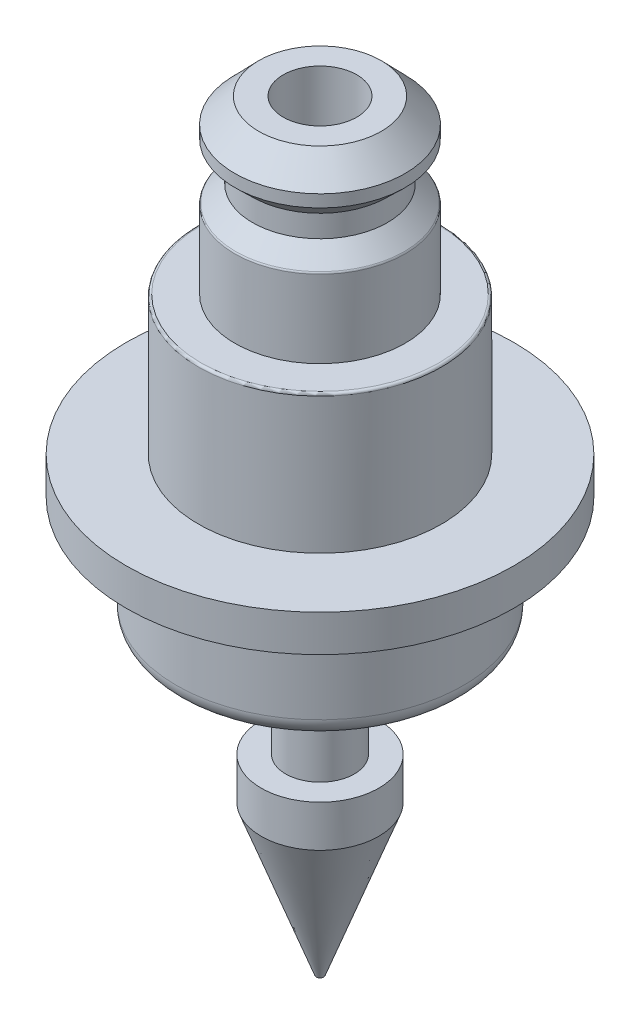
ISO-10303-21;
HEADER;
FILE_DESCRIPTION(('STEP AP214'),'2;1');
FILE_NAME('part.step','',(''),(''),'','','');
FILE_SCHEMA(('AUTOMOTIVE_DESIGN { 1 0 10303 214 1 1 1 1 }'));
ENDSEC;
DATA;
#1=APPLICATION_CONTEXT('core data for automotive mechanical design processes');
#2=APPLICATION_PROTOCOL_DEFINITION('international standard','automotive_design',2000,#1);
#3=PRODUCT_CONTEXT('',#1,'mechanical');
#4=PRODUCT('Part','Part','',(#3));
#5=PRODUCT_RELATED_PRODUCT_CATEGORY('part','',(#4));
#6=PRODUCT_DEFINITION_FORMATION('','',#4);
#7=PRODUCT_DEFINITION_CONTEXT('part definition',#1,'design');
#8=PRODUCT_DEFINITION('design','',#6,#7);
#9=PRODUCT_DEFINITION_SHAPE('','',#8);
#10=(LENGTH_UNIT() NAMED_UNIT(*) SI_UNIT(.MILLI.,.METRE.));
#11=(NAMED_UNIT(*) PLANE_ANGLE_UNIT() SI_UNIT($,.RADIAN.));
#12=(NAMED_UNIT(*) SI_UNIT($,.STERADIAN.) SOLID_ANGLE_UNIT());
#13=UNCERTAINTY_MEASURE_WITH_UNIT(LENGTH_MEASURE(1.E-05),#10,'distance_accuracy_value','');
#14=(GEOMETRIC_REPRESENTATION_CONTEXT(3) GLOBAL_UNCERTAINTY_ASSIGNED_CONTEXT((#13)) GLOBAL_UNIT_ASSIGNED_CONTEXT((#10,
#11,#12)) REPRESENTATION_CONTEXT('',''));
#15=CARTESIAN_POINT('',(0.,0.,0.));
#16=DIRECTION('',(0.,0.,1.));
#17=DIRECTION('',(1.,0.,0.));
#18=AXIS2_PLACEMENT_3D('',#15,#16,#17);
#19=CARTESIAN_POINT('',(0.,0.,0.));
#20=DIRECTION('',(0.,-1.,0.));
#21=DIRECTION('',(0.,0.,-1.));
#22=AXIS2_PLACEMENT_3D('',#19,#20,#21);
#23=CYLINDRICAL_SURFACE('',#22,1.5);
#24=CARTESIAN_POINT('',(0.,0.,0.));
#25=DIRECTION('',(0.,-1.,0.));
#26=DIRECTION('',(0.,0.,-1.));
#27=AXIS2_PLACEMENT_3D('',#24,#25,#26);
#28=CIRCLE('',#27,1.5);
#29=CARTESIAN_POINT('',(0.,0.,-1.5));
#30=VERTEX_POINT('',#29);
#31=EDGE_CURVE('E117',#30,#30,#28,.T.);
#32=ORIENTED_EDGE('',*,*,#31,.T.);
#33=EDGE_LOOP('',(#32));
#34=FACE_BOUND('',#33,.T.);
#35=CARTESIAN_POINT('',(0.,14.15,0.));
#36=DIRECTION('',(0.,-1.,0.));
#37=DIRECTION('',(0.,0.,-1.));
#38=AXIS2_PLACEMENT_3D('',#35,#36,#37);
#39=CIRCLE('',#38,1.5);
#40=CARTESIAN_POINT('',(0.,14.15,-1.5));
#41=VERTEX_POINT('',#40);
#42=EDGE_CURVE('E64',#41,#41,#39,.T.);
#43=ORIENTED_EDGE('',*,*,#42,.F.);
#44=EDGE_LOOP('',(#43));
#45=FACE_BOUND('',#44,.T.);
#46=ADVANCED_FACE('F38',(#34,#45),#23,.F.);
#47=CARTESIAN_POINT('',(1.5,14.15,0.));
#48=DIRECTION('',(0.,1.,0.));
#49=DIRECTION('',(0.,0.,1.));
#50=AXIS2_PLACEMENT_3D('',#47,#48,#49);
#51=PLANE('',#50);
#52=ORIENTED_EDGE('',*,*,#42,.T.);
#53=EDGE_LOOP('',(#52));
#54=FACE_BOUND('',#53,.T.);
#55=CARTESIAN_POINT('',(0.,14.15,0.));
#56=DIRECTION('',(0.,-1.,0.));
#57=DIRECTION('',(0.,0.,-1.));
#58=AXIS2_PLACEMENT_3D('',#55,#56,#57);
#59=CIRCLE('',#58,2.5);
#60=CARTESIAN_POINT('',(0.,14.15,-2.5));
#61=VERTEX_POINT('',#60);
#62=EDGE_CURVE('E67',#61,#61,#59,.T.);
#63=ORIENTED_EDGE('',*,*,#62,.F.);
#64=EDGE_LOOP('',(#63));
#65=FACE_BOUND('',#64,.T.);
#66=ADVANCED_FACE('F140',(#54,#65),#51,.T.);
#67=CARTESIAN_POINT('',(0.,13.15,0.));
#68=DIRECTION('',(0.,-1.,0.));
#69=DIRECTION('',(0.,0.,-1.));
#70=AXIS2_PLACEMENT_3D('',#67,#68,#69);
#71=CONICAL_SURFACE('',#70,3.475,0.772740611563396);
#72=ORIENTED_EDGE('',*,*,#62,.T.);
#73=EDGE_LOOP('',(#72));
#74=FACE_BOUND('',#73,.T.);
#75=CARTESIAN_POINT('',(0.,13.15,0.));
#76=DIRECTION('',(0.,-1.,0.));
#77=DIRECTION('',(0.,0.,-1.));
#78=AXIS2_PLACEMENT_3D('',#75,#76,#77);
#79=CIRCLE('',#78,3.475);
#80=CARTESIAN_POINT('',(0.,13.15,-3.475));
#81=VERTEX_POINT('',#80);
#82=EDGE_CURVE('E70',#81,#81,#79,.T.);
#83=ORIENTED_EDGE('',*,*,#82,.F.);
#84=EDGE_LOOP('',(#83));
#85=FACE_BOUND('',#84,.T.);
#86=ADVANCED_FACE('F145',(#74,#85),#71,.T.);
#87=CARTESIAN_POINT('',(0.,0.,0.));
#88=DIRECTION('',(0.,-1.,0.));
#89=DIRECTION('',(0.,0.,-1.));
#90=AXIS2_PLACEMENT_3D('',#87,#88,#89);
#91=CYLINDRICAL_SURFACE('',#90,3.475);
#92=ORIENTED_EDGE('',*,*,#82,.T.);
#93=EDGE_LOOP('',(#92));
#94=FACE_BOUND('',#93,.T.);
#95=CARTESIAN_POINT('',(0.,12.65,0.));
#96=DIRECTION('',(0.,-1.,0.));
#97=DIRECTION('',(0.,0.,-1.));
#98=AXIS2_PLACEMENT_3D('',#95,#96,#97);
#99=CIRCLE('',#98,3.475);
#100=CARTESIAN_POINT('',(0.,12.65,-3.475));
#101=VERTEX_POINT('',#100);
#102=EDGE_CURVE('E73',#101,#101,#99,.T.);
#103=ORIENTED_EDGE('',*,*,#102,.F.);
#104=EDGE_LOOP('',(#103));
#105=FACE_BOUND('',#104,.T.);
#106=ADVANCED_FACE('F187',(#94,#105),#91,.T.);
#107=CARTESIAN_POINT('',(0.,11.95,0.));
#108=DIRECTION('',(0.,1.,0.));
#109=DIRECTION('',(0.,0.,1.));
#110=AXIS2_PLACEMENT_3D('',#107,#108,#109);
#111=CONICAL_SURFACE('',#110,2.75,0.80294022345485);
#112=ORIENTED_EDGE('',*,*,#102,.T.);
#113=EDGE_LOOP('',(#112));
#114=FACE_BOUND('',#113,.T.);
#115=CARTESIAN_POINT('',(0.,11.95,0.));
#116=DIRECTION('',(0.,-1.,0.));
#117=DIRECTION('',(0.,0.,-1.));
#118=AXIS2_PLACEMENT_3D('',#115,#116,#117);
#119=CIRCLE('',#118,2.75);
#120=CARTESIAN_POINT('',(0.,11.95,-2.75));
#121=VERTEX_POINT('',#120);
#122=EDGE_CURVE('E76',#121,#121,#119,.T.);
#123=ORIENTED_EDGE('',*,*,#122,.F.);
#124=EDGE_LOOP('',(#123));
#125=FACE_BOUND('',#124,.T.);
#126=ADVANCED_FACE('F183',(#114,#125),#111,.T.);
#127=CARTESIAN_POINT('',(0.,0.,0.));
#128=DIRECTION('',(0.,-1.,0.));
#129=DIRECTION('',(0.,0.,-1.));
#130=AXIS2_PLACEMENT_3D('',#127,#128,#129);
#131=CYLINDRICAL_SURFACE('',#130,2.75);
#132=ORIENTED_EDGE('',*,*,#122,.T.);
#133=EDGE_LOOP('',(#132));
#134=FACE_BOUND('',#133,.T.);
#135=CARTESIAN_POINT('',(0.,11.05,0.));
#136=DIRECTION('',(0.,-1.,0.));
#137=DIRECTION('',(0.,0.,-1.));
#138=AXIS2_PLACEMENT_3D('',#135,#136,#137);
#139=CIRCLE('',#138,2.75);
#140=CARTESIAN_POINT('',(0.,11.05,-2.75));
#141=VERTEX_POINT('',#140);
#142=EDGE_CURVE('E79',#141,#141,#139,.T.);
#143=ORIENTED_EDGE('',*,*,#142,.F.);
#144=EDGE_LOOP('',(#143));
#145=FACE_BOUND('',#144,.T.);
#146=ADVANCED_FACE('F179',(#134,#145),#131,.T.);
#147=CARTESIAN_POINT('',(0.,10.35,0.));
#148=DIRECTION('',(0.,-1.,0.));
#149=DIRECTION('',(0.,0.,-1.));
#150=AXIS2_PLACEMENT_3D('',#147,#148,#149);
#151=CONICAL_SURFACE('',#150,3.475,0.802940223454851);
#152=CARTESIAN_POINT('',(0.,10.3794874262635,0.));
#153=DIRECTION('',(0.,1.,0.));
#154=DIRECTION('',(0.,0.,1.));
#155=AXIS2_PLACEMENT_3D('',#152,#153,#154);
#156=CIRCLE('',#155,3.44445945136996);
#157=CARTESIAN_POINT('',(0.,10.3794874262635,3.44445945136996));
#158=VERTEX_POINT('',#157);
#159=EDGE_CURVE('E49',#158,#158,#156,.T.);
#160=ORIENTED_EDGE('',*,*,#159,.T.);
#161=EDGE_LOOP('',(#160));
#162=FACE_BOUND('',#161,.T.);
#163=ORIENTED_EDGE('',*,*,#142,.T.);
#164=EDGE_LOOP('',(#163));
#165=FACE_BOUND('',#164,.T.);
#166=ADVANCED_FACE('F163',(#162,#165),#151,.T.);
#167=CARTESIAN_POINT('',(0.,0.,0.));
#168=DIRECTION('',(0.,-1.,0.));
#169=DIRECTION('',(0.,0.,-1.));
#170=AXIS2_PLACEMENT_3D('',#167,#168,#169);
#171=CYLINDRICAL_SURFACE('',#170,3.475);
#172=CARTESIAN_POINT('',(0.,10.3075472802017,0.));
#173=DIRECTION('',(0.,1.,0.));
#174=DIRECTION('',(0.,0.,1.));
#175=AXIS2_PLACEMENT_3D('',#172,#173,#174);
#176=CIRCLE('',#175,3.475);
#177=CARTESIAN_POINT('',(0.,10.3075472802017,3.475));
#178=VERTEX_POINT('',#177);
#179=EDGE_CURVE('E53',#178,#178,#176,.F.);
#180=ORIENTED_EDGE('',*,*,#179,.T.);
#181=EDGE_LOOP('',(#180));
#182=FACE_BOUND('',#181,.T.);
#183=CARTESIAN_POINT('',(0.,7.15,0.));
#184=DIRECTION('',(0.,-1.,0.));
#185=DIRECTION('',(0.,0.,-1.));
#186=AXIS2_PLACEMENT_3D('',#183,#184,#185);
#187=CIRCLE('',#186,3.475);
#188=CARTESIAN_POINT('',(0.,7.15,-3.475));
#189=VERTEX_POINT('',#188);
#190=EDGE_CURVE('E82',#189,#189,#187,.T.);
#191=ORIENTED_EDGE('',*,*,#190,.F.);
#192=EDGE_LOOP('',(#191));
#193=FACE_BOUND('',#192,.T.);
#194=ADVANCED_FACE('F159',(#182,#193),#171,.T.);
#195=CARTESIAN_POINT('',(3.475,7.15,0.));
#196=DIRECTION('',(0.,1.,0.));
#197=DIRECTION('',(0.,0.,1.));
#198=AXIS2_PLACEMENT_3D('',#195,#196,#197);
#199=PLANE('',#198);
#200=CARTESIAN_POINT('',(0.,7.15,0.));
#201=DIRECTION('',(0.,1.,0.));
#202=DIRECTION('',(0.,0.,1.));
#203=AXIS2_PLACEMENT_3D('',#200,#201,#202);
#204=CIRCLE('',#203,4.855);
#205=CARTESIAN_POINT('',(0.,7.15,4.855));
#206=VERTEX_POINT('',#205);
#207=EDGE_CURVE('E10',#206,#206,#204,.T.);
#208=ORIENTED_EDGE('',*,*,#207,.T.);
#209=EDGE_LOOP('',(#208));
#210=FACE_BOUND('',#209,.T.);
#211=ORIENTED_EDGE('',*,*,#190,.T.);
#212=EDGE_LOOP('',(#211));
#213=FACE_BOUND('',#212,.T.);
#214=ADVANCED_FACE('F162',(#210,#213),#199,.T.);
#215=CARTESIAN_POINT('',(0.,0.,0.));
#216=DIRECTION('',(0.,-1.,0.));
#217=DIRECTION('',(0.,0.,-1.));
#218=AXIS2_PLACEMENT_3D('',#215,#216,#217);
#219=CYLINDRICAL_SURFACE('',#218,4.955);
#220=CARTESIAN_POINT('',(0.,7.05,0.));
#221=DIRECTION('',(0.,1.,0.));
#222=DIRECTION('',(0.,0.,1.));
#223=AXIS2_PLACEMENT_3D('',#220,#221,#222);
#224=CIRCLE('',#223,4.955);
#225=CARTESIAN_POINT('',(0.,7.05,4.955));
#226=VERTEX_POINT('',#225);
#227=EDGE_CURVE('E45',#226,#226,#224,.F.);
#228=ORIENTED_EDGE('',*,*,#227,.T.);
#229=EDGE_LOOP('',(#228));
#230=FACE_BOUND('',#229,.T.);
#231=CARTESIAN_POINT('',(0.,1.5,0.));
#232=DIRECTION('',(0.,-1.,0.));
#233=DIRECTION('',(0.,0.,-1.));
#234=AXIS2_PLACEMENT_3D('',#231,#232,#233);
#235=CIRCLE('',#234,4.955);
#236=CARTESIAN_POINT('',(0.,1.5,-4.955));
#237=VERTEX_POINT('',#236);
#238=EDGE_CURVE('E85',#237,#237,#235,.T.);
#239=ORIENTED_EDGE('',*,*,#238,.F.);
#240=EDGE_LOOP('',(#239));
#241=FACE_BOUND('',#240,.T.);
#242=ADVANCED_FACE('F168',(#230,#241),#219,.T.);
#243=CARTESIAN_POINT('',(4.955,1.5,0.));
#244=DIRECTION('',(0.,1.,0.));
#245=DIRECTION('',(0.,0.,1.));
#246=AXIS2_PLACEMENT_3D('',#243,#244,#245);
#247=PLANE('',#246);
#248=ORIENTED_EDGE('',*,*,#238,.T.);
#249=EDGE_LOOP('',(#248));
#250=FACE_BOUND('',#249,.T.);
#251=CARTESIAN_POINT('',(0.,1.5,0.));
#252=DIRECTION('',(0.,-1.,0.));
#253=DIRECTION('',(0.,0.,-1.));
#254=AXIS2_PLACEMENT_3D('',#251,#252,#253);
#255=CIRCLE('',#254,7.9);
#256=CARTESIAN_POINT('',(0.,1.5,-7.9));
#257=VERTEX_POINT('',#256);
#258=EDGE_CURVE('E88',#257,#257,#255,.T.);
#259=ORIENTED_EDGE('',*,*,#258,.F.);
#260=EDGE_LOOP('',(#259));
#261=FACE_BOUND('',#260,.T.);
#262=ADVANCED_FACE('F173',(#250,#261),#247,.T.);
#263=CARTESIAN_POINT('',(0.,0.,0.));
#264=DIRECTION('',(0.,-1.,0.));
#265=DIRECTION('',(0.,0.,-1.));
#266=AXIS2_PLACEMENT_3D('',#263,#264,#265);
#267=CYLINDRICAL_SURFACE('',#266,7.9);
#268=ORIENTED_EDGE('',*,*,#258,.T.);
#269=EDGE_LOOP('',(#268));
#270=FACE_BOUND('',#269,.T.);
#271=CARTESIAN_POINT('',(0.,0.,0.));
#272=DIRECTION('',(0.,-1.,0.));
#273=DIRECTION('',(0.,0.,-1.));
#274=AXIS2_PLACEMENT_3D('',#271,#272,#273);
#275=CIRCLE('',#274,7.9);
#276=CARTESIAN_POINT('',(0.,0.,-7.9));
#277=VERTEX_POINT('',#276);
#278=EDGE_CURVE('E91',#277,#277,#275,.T.);
#279=ORIENTED_EDGE('',*,*,#278,.F.);
#280=EDGE_LOOP('',(#279));
#281=FACE_BOUND('',#280,.T.);
#282=ADVANCED_FACE('F335',(#270,#281),#267,.T.);
#283=CARTESIAN_POINT('',(7.9,0.,0.));
#284=DIRECTION('',(0.,-1.,0.));
#285=DIRECTION('',(0.,0.,-1.));
#286=AXIS2_PLACEMENT_3D('',#283,#284,#285);
#287=PLANE('',#286);
#288=ORIENTED_EDGE('',*,*,#278,.T.);
#289=EDGE_LOOP('',(#288));
#290=FACE_BOUND('',#289,.T.);
#291=CARTESIAN_POINT('',(0.,0.,0.));
#292=DIRECTION('',(0.,-1.,0.));
#293=DIRECTION('',(0.,0.,-1.));
#294=AXIS2_PLACEMENT_3D('',#291,#292,#293);
#295=CIRCLE('',#294,5.85);
#296=CARTESIAN_POINT('',(0.,0.,-5.85));
#297=VERTEX_POINT('',#296);
#298=EDGE_CURVE('E94',#297,#297,#295,.T.);
#299=ORIENTED_EDGE('',*,*,#298,.F.);
#300=EDGE_LOOP('',(#299));
#301=FACE_BOUND('',#300,.T.);
#302=ADVANCED_FACE('F326',(#290,#301),#287,.T.);
#303=CARTESIAN_POINT('',(0.,0.,0.));
#304=DIRECTION('',(0.,-1.,0.));
#305=DIRECTION('',(0.,0.,-1.));
#306=AXIS2_PLACEMENT_3D('',#303,#304,#305);
#307=CYLINDRICAL_SURFACE('',#306,5.85);
#308=CARTESIAN_POINT('',(0.,-3.75,0.));
#309=DIRECTION('',(0.,-1.,0.));
#310=DIRECTION('',(0.,0.,-1.));
#311=AXIS2_PLACEMENT_3D('',#308,#309,#310);
#312=CIRCLE('',#311,5.85);
#313=CARTESIAN_POINT('',(0.,-3.75,-5.85));
#314=VERTEX_POINT('',#313);
#315=EDGE_CURVE('E58',#314,#314,#312,.F.);
#316=ORIENTED_EDGE('',*,*,#315,.T.);
#317=EDGE_LOOP('',(#316));
#318=FACE_BOUND('',#317,.T.);
#319=ORIENTED_EDGE('',*,*,#298,.T.);
#320=EDGE_LOOP('',(#319));
#321=FACE_BOUND('',#320,.T.);
#322=ADVANCED_FACE('F317',(#318,#321),#307,.T.);
#323=CARTESIAN_POINT('',(5.85,-4.5,0.));
#324=DIRECTION('',(0.,-1.,0.));
#325=DIRECTION('',(0.,0.,-1.));
#326=AXIS2_PLACEMENT_3D('',#323,#324,#325);
#327=PLANE('',#326);
#328=CARTESIAN_POINT('',(0.,-4.5,0.));
#329=DIRECTION('',(0.,-1.,0.));
#330=DIRECTION('',(0.,0.,-1.));
#331=AXIS2_PLACEMENT_3D('',#328,#329,#330);
#332=CIRCLE('',#331,5.1);
#333=CARTESIAN_POINT('',(0.,-4.5,-5.1));
#334=VERTEX_POINT('',#333);
#335=EDGE_CURVE('E61',#334,#334,#332,.T.);
#336=ORIENTED_EDGE('',*,*,#335,.T.);
#337=EDGE_LOOP('',(#336));
#338=FACE_BOUND('',#337,.T.);
#339=CARTESIAN_POINT('',(0.,-4.5,0.));
#340=DIRECTION('',(0.,-1.,0.));
#341=DIRECTION('',(0.,0.,-1.));
#342=AXIS2_PLACEMENT_3D('',#339,#340,#341);
#343=CIRCLE('',#342,1.4);
#344=CARTESIAN_POINT('',(0.,-4.5,-1.4));
#345=VERTEX_POINT('',#344);
#346=EDGE_CURVE('E97',#345,#345,#343,.T.);
#347=ORIENTED_EDGE('',*,*,#346,.F.);
#348=EDGE_LOOP('',(#347));
#349=FACE_BOUND('',#348,.T.);
#350=ADVANCED_FACE('F308',(#338,#349),#327,.T.);
#351=CARTESIAN_POINT('',(0.,0.,0.));
#352=DIRECTION('',(0.,-1.,0.));
#353=DIRECTION('',(0.,0.,-1.));
#354=AXIS2_PLACEMENT_3D('',#351,#352,#353);
#355=CYLINDRICAL_SURFACE('',#354,1.4);
#356=ORIENTED_EDGE('',*,*,#346,.T.);
#357=EDGE_LOOP('',(#356));
#358=FACE_BOUND('',#357,.T.);
#359=CARTESIAN_POINT('',(0.,-9.1,0.));
#360=DIRECTION('',(0.,-1.,0.));
#361=DIRECTION('',(0.,0.,-1.));
#362=AXIS2_PLACEMENT_3D('',#359,#360,#361);
#363=CIRCLE('',#362,1.4);
#364=CARTESIAN_POINT('',(0.,-9.1,-1.4));
#365=VERTEX_POINT('',#364);
#366=EDGE_CURVE('E100',#365,#365,#363,.T.);
#367=ORIENTED_EDGE('',*,*,#366,.F.);
#368=EDGE_LOOP('',(#367));
#369=FACE_BOUND('',#368,.T.);
#370=ADVANCED_FACE('F298',(#358,#369),#355,.T.);
#371=CARTESIAN_POINT('',(1.4,-9.1,0.));
#372=DIRECTION('',(0.,1.,0.));
#373=DIRECTION('',(0.,0.,1.));
#374=AXIS2_PLACEMENT_3D('',#371,#372,#373);
#375=PLANE('',#374);
#376=ORIENTED_EDGE('',*,*,#366,.T.);
#377=EDGE_LOOP('',(#376));
#378=FACE_BOUND('',#377,.T.);
#379=CARTESIAN_POINT('',(0.,-9.1,0.));
#380=DIRECTION('',(0.,-1.,0.));
#381=DIRECTION('',(0.,0.,-1.));
#382=AXIS2_PLACEMENT_3D('',#379,#380,#381);
#383=CIRCLE('',#382,2.4);
#384=CARTESIAN_POINT('',(0.,-9.1,-2.4));
#385=VERTEX_POINT('',#384);
#386=EDGE_CURVE('E103',#385,#385,#383,.T.);
#387=ORIENTED_EDGE('',*,*,#386,.F.);
#388=EDGE_LOOP('',(#387));
#389=FACE_BOUND('',#388,.T.);
#390=ADVANCED_FACE('F288',(#378,#389),#375,.T.);
#391=CARTESIAN_POINT('',(0.,0.,0.));
#392=DIRECTION('',(0.,-1.,0.));
#393=DIRECTION('',(0.,0.,-1.));
#394=AXIS2_PLACEMENT_3D('',#391,#392,#393);
#395=CYLINDRICAL_SURFACE('',#394,2.4);
#396=ORIENTED_EDGE('',*,*,#386,.T.);
#397=EDGE_LOOP('',(#396));
#398=FACE_BOUND('',#397,.T.);
#399=CARTESIAN_POINT('',(0.,-10.8,0.));
#400=DIRECTION('',(0.,-1.,0.));
#401=DIRECTION('',(0.,0.,-1.));
#402=AXIS2_PLACEMENT_3D('',#399,#400,#401);
#403=CIRCLE('',#402,2.4);
#404=CARTESIAN_POINT('',(0.,-10.8,2.4));
#405=VERTEX_POINT('',#404);
#406=EDGE_CURVE('E106',#405,#405,#403,.T.);
#407=ORIENTED_EDGE('',*,*,#406,.F.);
#408=EDGE_LOOP('',(#407));
#409=FACE_BOUND('',#408,.T.);
#410=ADVANCED_FACE('F278',(#398,#409),#395,.T.);
#411=CARTESIAN_POINT('',(0.,-16.9,0.));
#412=DIRECTION('',(0.,1.,0.));
#413=DIRECTION('',(0.,0.,1.));
#414=AXIS2_PLACEMENT_3D('',#411,#412,#413);
#415=CONICAL_SURFACE('',#414,0.15,0.353370182719398);
#416=CARTESIAN_POINT('',(0.,-16.9,0.));
#417=DIRECTION('',(0.,-1.,0.));
#418=DIRECTION('',(0.,0.,-1.));
#419=AXIS2_PLACEMENT_3D('',#416,#417,#418);
#420=CIRCLE('',#419,0.15);
#421=CARTESIAN_POINT('',(0.,-16.9,0.150000000000001));
#422=VERTEX_POINT('',#421);
#423=EDGE_CURVE('E110',#422,#422,#420,.T.);
#424=CARTESIAN_POINT('',(0.,-10.8,2.4));
#425=CARTESIAN_POINT('',(0.,-10.8635416666667,2.3765625));
#426=CARTESIAN_POINT('',(0.,-10.9270833333333,2.353125));
#427=CARTESIAN_POINT('',(0.,-11.0541666666667,2.30625));
#428=CARTESIAN_POINT('',(0.,-11.1177083333333,2.2828125));
#429=CARTESIAN_POINT('',(0.,-11.2447916666667,2.2359375));
#430=CARTESIAN_POINT('',(0.,-11.3083333333333,2.2125));
#431=CARTESIAN_POINT('',(0.,-11.4354166666667,2.165625));
#432=CARTESIAN_POINT('',(0.,-11.4989583333333,2.1421875));
#433=CARTESIAN_POINT('',(0.,-11.6260416666667,2.0953125));
#434=CARTESIAN_POINT('',(0.,-11.6895833333333,2.071875));
#435=CARTESIAN_POINT('',(0.,-11.8166666666667,2.025));
#436=CARTESIAN_POINT('',(0.,-11.8802083333333,2.0015625));
#437=CARTESIAN_POINT('',(0.,-12.0072916666667,1.9546875));
#438=CARTESIAN_POINT('',(0.,-12.0708333333333,1.93125));
#439=CARTESIAN_POINT('',(0.,-12.1979166666667,1.884375));
#440=CARTESIAN_POINT('',(0.,-12.2614583333333,1.8609375));
#441=CARTESIAN_POINT('',(0.,-12.3885416666667,1.8140625));
#442=CARTESIAN_POINT('',(0.,-12.4520833333333,1.790625));
#443=CARTESIAN_POINT('',(0.,-12.5791666666667,1.74375));
#444=CARTESIAN_POINT('',(0.,-12.6427083333333,1.7203125));
#445=CARTESIAN_POINT('',(0.,-12.7697916666667,1.6734375));
#446=CARTESIAN_POINT('',(0.,-12.8333333333333,1.65));
#447=CARTESIAN_POINT('',(0.,-12.9604166666667,1.603125));
#448=CARTESIAN_POINT('',(0.,-13.0239583333333,1.5796875));
#449=CARTESIAN_POINT('',(0.,-13.1510416666667,1.5328125));
#450=CARTESIAN_POINT('',(0.,-13.2145833333333,1.509375));
#451=CARTESIAN_POINT('',(0.,-13.3416666666667,1.4625));
#452=CARTESIAN_POINT('',(0.,-13.4052083333333,1.4390625));
#453=CARTESIAN_POINT('',(0.,-13.5322916666667,1.3921875));
#454=CARTESIAN_POINT('',(0.,-13.5958333333333,1.36875));
#455=CARTESIAN_POINT('',(0.,-13.7229166666667,1.321875));
#456=CARTESIAN_POINT('',(0.,-13.7864583333333,1.2984375));
#457=CARTESIAN_POINT('',(0.,-13.9135416666667,1.2515625));
#458=CARTESIAN_POINT('',(0.,-13.9770833333333,1.228125));
#459=CARTESIAN_POINT('',(0.,-14.1041666666667,1.18125));
#460=CARTESIAN_POINT('',(0.,-14.1677083333333,1.1578125));
#461=CARTESIAN_POINT('',(0.,-14.2947916666667,1.1109375));
#462=CARTESIAN_POINT('',(0.,-14.3583333333333,1.0875));
#463=CARTESIAN_POINT('',(0.,-14.4854166666667,1.040625));
#464=CARTESIAN_POINT('',(0.,-14.5489583333333,1.0171875));
#465=CARTESIAN_POINT('',(0.,-14.6760416666667,0.9703125));
#466=CARTESIAN_POINT('',(0.,-14.7395833333333,0.946875));
#467=CARTESIAN_POINT('',(0.,-14.8666666666667,0.9));
#468=CARTESIAN_POINT('',(0.,-14.9302083333333,0.8765625));
#469=CARTESIAN_POINT('',(0.,-15.0572916666667,0.8296875));
#470=CARTESIAN_POINT('',(0.,-15.1208333333333,0.80625));
#471=CARTESIAN_POINT('',(0.,-15.2479166666667,0.759375));
#472=CARTESIAN_POINT('',(0.,-15.3114583333333,0.7359375));
#473=CARTESIAN_POINT('',(0.,-15.4385416666667,0.6890625));
#474=CARTESIAN_POINT('',(0.,-15.5020833333333,0.665625));
#475=CARTESIAN_POINT('',(0.,-15.6291666666667,0.61875));
#476=CARTESIAN_POINT('',(0.,-15.6927083333333,0.595312500000001));
#477=CARTESIAN_POINT('',(0.,-15.8197916666667,0.548437500000001));
#478=CARTESIAN_POINT('',(0.,-15.8833333333333,0.525));
#479=CARTESIAN_POINT('',(0.,-16.0104166666667,0.478125));
#480=CARTESIAN_POINT('',(0.,-16.0739583333333,0.454687500000001));
#481=CARTESIAN_POINT('',(0.,-16.2010416666667,0.407812500000001));
#482=CARTESIAN_POINT('',(0.,-16.2645833333333,0.384375));
#483=CARTESIAN_POINT('',(0.,-16.3916666666667,0.3375));
#484=CARTESIAN_POINT('',(0.,-16.4552083333333,0.3140625));
#485=CARTESIAN_POINT('',(0.,-16.5822916666667,0.267187500000001));
#486=CARTESIAN_POINT('',(0.,-16.6458333333333,0.24375));
#487=CARTESIAN_POINT('',(0.,-16.7729166666667,0.196875000000001));
#488=CARTESIAN_POINT('',(0.,-16.8364583333333,0.173437500000001));
#489=CARTESIAN_POINT('',(0.,-16.9,0.150000000000001));
#490=B_SPLINE_CURVE_WITH_KNOTS('',3,(#424,#425,#426,#427,#428,#429,#430,#431,#432,#433,#434,
#435,#436,#437,#438,#439,#440,#441,#442,#443,#444,#445,#446,#447,#448,#449,#450,#451,#452,#453,
#454,#455,#456,#457,#458,#459,#460,#461,#462,#463,#464,#465,#466,#467,#468,#469,#470,#471,#472,
#473,#474,#475,#476,#477,#478,#479,#480,#481,#482,#483,#484,#485,#486,#487,#488,#489),
.UNSPECIFIED.,.F.,.F.,(4,2,2,2,2,2,2,2,2,2,2,2,2,2,2,2,2,2,2,2,2,2,2,2,2,2,2,2,2,2,2,2,4),(0.,
0.203179079339507,0.406358158679015,0.609537238018523,0.81271631735803,1.01589539669754,
1.21907447603705,1.42225355537655,1.62543263471606,1.82861171405557,2.03179079339508,
2.23496987273459,2.43814895207409,2.6413280314136,2.84450711075311,3.04768619009262,
3.25086526943212,3.45404434877163,3.65722342811114,3.86040250745065,4.06358158679015,
4.26676066612966,4.46993974546917,4.67311882480868,4.87629790414818,5.07947698348769,
5.2826560628272,5.48583514216671,5.68901422150622,5.89219330084573,6.09537238018523,
6.29855145952474,6.50173053886425),.UNSPECIFIED.);
#491=EDGE_CURVE('BSEAM136',#405,#422,#490,.T.);
#492=ORIENTED_EDGE('',*,*,#406,.T.);
#493=ORIENTED_EDGE('',*,*,#423,.F.);
#494=ORIENTED_EDGE('',*,*,#491,.T.);
#495=ORIENTED_EDGE('',*,*,#491,.F.);
#496=EDGE_LOOP('',(#492,#494,#493,#495));
#497=FACE_BOUND('',#496,.T.);
#498=ADVANCED_FACE('F136',(#497),#415,.T.);
#499=CARTESIAN_POINT('',(0.,0.,0.));
#500=DIRECTION('',(0.,-1.,0.));
#501=DIRECTION('',(0.,0.,-1.));
#502=AXIS2_PLACEMENT_3D('',#499,#500,#501);
#503=CYLINDRICAL_SURFACE('',#502,0.15);
#504=ORIENTED_EDGE('',*,*,#423,.T.);
#505=EDGE_LOOP('',(#504));
#506=FACE_BOUND('',#505,.T.);
#507=CARTESIAN_POINT('',(0.,0.,0.));
#508=DIRECTION('',(0.,-1.,0.));
#509=DIRECTION('',(0.,0.,-1.));
#510=AXIS2_PLACEMENT_3D('',#507,#508,#509);
#511=CIRCLE('',#510,0.15);
#512=CARTESIAN_POINT('',(0.,0.,-0.15));
#513=VERTEX_POINT('',#512);
#514=EDGE_CURVE('E114',#513,#513,#511,.T.);
#515=ORIENTED_EDGE('',*,*,#514,.F.);
#516=EDGE_LOOP('',(#515));
#517=FACE_BOUND('',#516,.T.);
#518=ADVANCED_FACE('F126',(#506,#517),#503,.F.);
#519=CARTESIAN_POINT('',(0.15,0.,0.));
#520=DIRECTION('',(0.,1.,0.));
#521=DIRECTION('',(0.,0.,1.));
#522=AXIS2_PLACEMENT_3D('',#519,#520,#521);
#523=PLANE('',#522);
#524=ORIENTED_EDGE('',*,*,#514,.T.);
#525=EDGE_LOOP('',(#524));
#526=FACE_BOUND('',#525,.T.);
#527=ORIENTED_EDGE('',*,*,#31,.F.);
#528=EDGE_LOOP('',(#527));
#529=FACE_BOUND('',#528,.T.);
#530=ADVANCED_FACE('F123',(#526,#529),#523,.T.);
#531=CARTESIAN_POINT('',(0.,-3.75,0.));
#532=DIRECTION('',(0.,-1.,0.));
#533=DIRECTION('',(0.,0.,-1.));
#534=AXIS2_PLACEMENT_3D('',#531,#532,#533);
#535=TOROIDAL_SURFACE('',#534,5.1,0.75);
#536=ORIENTED_EDGE('',*,*,#315,.F.);
#537=EDGE_LOOP('',(#536));
#538=FACE_BOUND('',#537,.T.);
#539=ORIENTED_EDGE('',*,*,#335,.F.);
#540=EDGE_LOOP('',(#539));
#541=FACE_BOUND('',#540,.T.);
#542=ADVANCED_FACE('F125',(#538,#541),#535,.T.);
#543=CARTESIAN_POINT('',(0.,10.3075472802017,0.));
#544=DIRECTION('',(0.,1.,0.));
#545=DIRECTION('',(0.,0.,1.));
#546=AXIS2_PLACEMENT_3D('',#543,#544,#545);
#547=TOROIDAL_SURFACE('',#546,3.375,0.1);
#548=ORIENTED_EDGE('',*,*,#159,.F.);
#549=EDGE_LOOP('',(#548));
#550=FACE_BOUND('',#549,.T.);
#551=ORIENTED_EDGE('',*,*,#179,.F.);
#552=EDGE_LOOP('',(#551));
#553=FACE_BOUND('',#552,.T.);
#554=ADVANCED_FACE('F133',(#550,#553),#547,.T.);
#555=CARTESIAN_POINT('',(0.,7.05,0.));
#556=DIRECTION('',(0.,1.,0.));
#557=DIRECTION('',(0.,0.,1.));
#558=AXIS2_PLACEMENT_3D('',#555,#556,#557);
#559=TOROIDAL_SURFACE('',#558,4.855,0.1);
#560=ORIENTED_EDGE('',*,*,#207,.F.);
#561=EDGE_LOOP('',(#560));
#562=FACE_BOUND('',#561,.T.);
#563=ORIENTED_EDGE('',*,*,#227,.F.);
#564=EDGE_LOOP('',(#563));
#565=FACE_BOUND('',#564,.T.);
#566=ADVANCED_FACE('F40',(#562,#565),#559,.T.);
#567=CLOSED_SHELL('',(#46,#66,#86,#106,#126,#146,#166,#194,#214,#242,#262,#282,#302,#322,#350,
#370,#390,#410,#498,#518,#530,#542,#554,#566));
#568=MANIFOLD_SOLID_BREP('B2',#567);
#569=ADVANCED_BREP_SHAPE_REPRESENTATION('',(#18,#568),#14);
#570=SHAPE_DEFINITION_REPRESENTATION(#9,#569);
ENDSEC;
END-ISO-10303-21;
